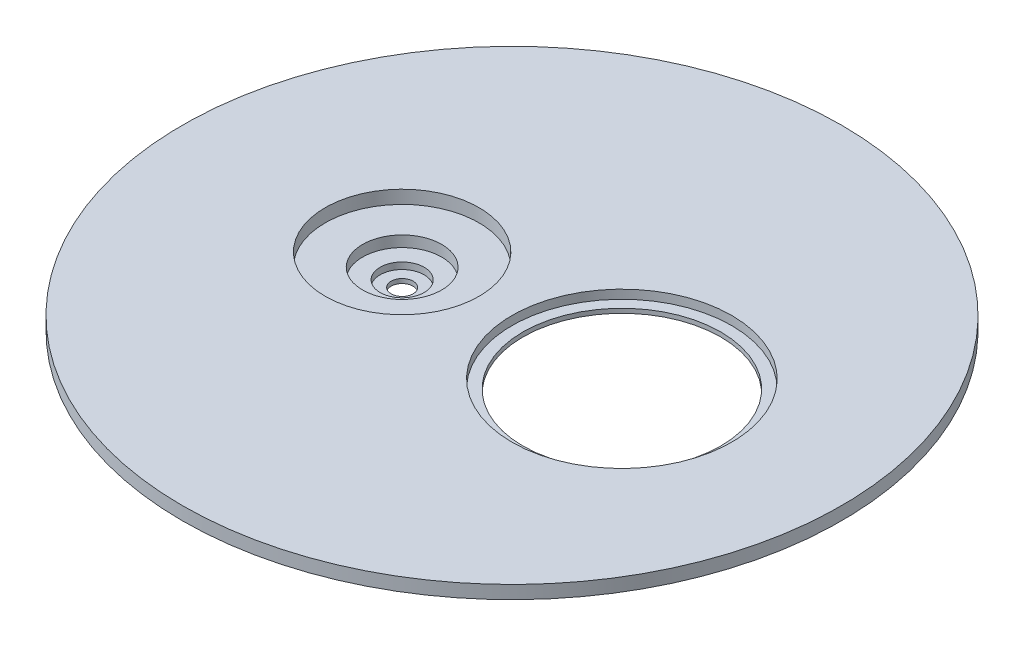
ISO-10303-21;
HEADER;
FILE_DESCRIPTION(('STEP AP214'),'2;1');
FILE_NAME('part.step','',(''),(''),'','','');
FILE_SCHEMA(('AUTOMOTIVE_DESIGN { 1 0 10303 214 1 1 1 1 }'));
ENDSEC;
DATA;
#1=APPLICATION_CONTEXT('core data for automotive mechanical design processes');
#2=APPLICATION_PROTOCOL_DEFINITION('international standard','automotive_design',2000,#1);
#3=PRODUCT_CONTEXT('',#1,'mechanical');
#4=PRODUCT('Part','Part','',(#3));
#5=PRODUCT_RELATED_PRODUCT_CATEGORY('part','',(#4));
#6=PRODUCT_DEFINITION_FORMATION('','',#4);
#7=PRODUCT_DEFINITION_CONTEXT('part definition',#1,'design');
#8=PRODUCT_DEFINITION('design','',#6,#7);
#9=PRODUCT_DEFINITION_SHAPE('','',#8);
#10=(LENGTH_UNIT() NAMED_UNIT(*) SI_UNIT(.MILLI.,.METRE.));
#11=(NAMED_UNIT(*) PLANE_ANGLE_UNIT() SI_UNIT($,.RADIAN.));
#12=(NAMED_UNIT(*) SI_UNIT($,.STERADIAN.) SOLID_ANGLE_UNIT());
#13=UNCERTAINTY_MEASURE_WITH_UNIT(LENGTH_MEASURE(1.E-05),#10,'distance_accuracy_value','');
#14=(GEOMETRIC_REPRESENTATION_CONTEXT(3) GLOBAL_UNCERTAINTY_ASSIGNED_CONTEXT((#13)) GLOBAL_UNIT_ASSIGNED_CONTEXT((#10,
#11,#12)) REPRESENTATION_CONTEXT('',''));
#15=CARTESIAN_POINT('',(0.,0.,0.));
#16=DIRECTION('',(0.,0.,1.));
#17=DIRECTION('',(1.,0.,0.));
#18=AXIS2_PLACEMENT_3D('',#15,#16,#17);
#19=CARTESIAN_POINT('',(-25.,-5.,0.));
#20=DIRECTION('',(0.,1.,0.));
#21=DIRECTION('',(0.,0.,1.));
#22=AXIS2_PLACEMENT_3D('',#19,#20,#21);
#23=CYLINDRICAL_SURFACE('',#22,2.5);
#24=CARTESIAN_POINT('',(-25.,-5.,0.));
#25=DIRECTION('',(0.,-1.,0.));
#26=DIRECTION('',(0.,0.,-1.));
#27=AXIS2_PLACEMENT_3D('',#24,#25,#26);
#28=CIRCLE('',#27,2.5);
#29=CARTESIAN_POINT('',(-25.,-5.,-2.5));
#30=VERTEX_POINT('',#29);
#31=EDGE_CURVE('E80',#30,#30,#28,.T.);
#32=ORIENTED_EDGE('',*,*,#31,.T.);
#33=EDGE_LOOP('',(#32));
#34=FACE_BOUND('',#33,.T.);
#35=CARTESIAN_POINT('',(-25.,-4.,0.));
#36=DIRECTION('',(0.,1.,0.));
#37=DIRECTION('',(0.,0.,1.));
#38=AXIS2_PLACEMENT_3D('',#35,#36,#37);
#39=CIRCLE('',#38,2.5);
#40=CARTESIAN_POINT('',(-25.,-4.,2.5));
#41=VERTEX_POINT('',#40);
#42=EDGE_CURVE('E36',#41,#41,#39,.T.);
#43=ORIENTED_EDGE('',*,*,#42,.T.);
#44=EDGE_LOOP('',(#43));
#45=FACE_BOUND('',#44,.T.);
#46=ADVANCED_FACE('F32',(#34,#45),#23,.F.);
#47=CARTESIAN_POINT('',(0.,3.,0.));
#48=DIRECTION('',(0.,-1.,0.));
#49=DIRECTION('',(0.,0.,-1.));
#50=AXIS2_PLACEMENT_3D('',#47,#48,#49);
#51=CYLINDRICAL_SURFACE('',#50,75.);
#52=CARTESIAN_POINT('',(0.,3.,0.));
#53=DIRECTION('',(0.,1.,0.));
#54=DIRECTION('',(0.,0.,1.));
#55=AXIS2_PLACEMENT_3D('',#52,#53,#54);
#56=CIRCLE('',#55,75.);
#57=CARTESIAN_POINT('',(0.,3.,75.));
#58=VERTEX_POINT('',#57);
#59=EDGE_CURVE('E40',#58,#58,#56,.T.);
#60=ORIENTED_EDGE('',*,*,#59,.F.);
#61=EDGE_LOOP('',(#60));
#62=FACE_BOUND('',#61,.T.);
#63=CARTESIAN_POINT('',(0.,0.,0.));
#64=DIRECTION('',(0.,1.,0.));
#65=DIRECTION('',(0.,0.,1.));
#66=AXIS2_PLACEMENT_3D('',#63,#64,#65);
#67=CIRCLE('',#66,75.);
#68=CARTESIAN_POINT('',(0.,0.,75.));
#69=VERTEX_POINT('',#68);
#70=EDGE_CURVE('E44',#69,#69,#67,.T.);
#71=ORIENTED_EDGE('',*,*,#70,.T.);
#72=EDGE_LOOP('',(#71));
#73=FACE_BOUND('',#72,.T.);
#74=ADVANCED_FACE('F34',(#62,#73),#51,.T.);
#75=CARTESIAN_POINT('',(0.,3.,0.));
#76=DIRECTION('',(0.,1.,0.));
#77=DIRECTION('',(0.,0.,1.));
#78=AXIS2_PLACEMENT_3D('',#75,#76,#77);
#79=PLANE('',#78);
#80=CARTESIAN_POINT('',(-25.,3.,0.));
#81=DIRECTION('',(0.,1.,0.));
#82=DIRECTION('',(0.,0.,1.));
#83=AXIS2_PLACEMENT_3D('',#80,#81,#82);
#84=CIRCLE('',#83,17.5);
#85=CARTESIAN_POINT('',(-25.,3.,17.5));
#86=VERTEX_POINT('',#85);
#87=EDGE_CURVE('E50',#86,#86,#84,.T.);
#88=ORIENTED_EDGE('',*,*,#87,.F.);
#89=EDGE_LOOP('',(#88));
#90=FACE_BOUND('',#89,.T.);
#91=CARTESIAN_POINT('',(25.,3.,0.));
#92=DIRECTION('',(0.,1.,0.));
#93=DIRECTION('',(0.,0.,1.));
#94=AXIS2_PLACEMENT_3D('',#91,#92,#93);
#95=CIRCLE('',#94,25.);
#96=CARTESIAN_POINT('',(25.,3.,25.));
#97=VERTEX_POINT('',#96);
#98=EDGE_CURVE('E55',#97,#97,#95,.T.);
#99=ORIENTED_EDGE('',*,*,#98,.F.);
#100=EDGE_LOOP('',(#99));
#101=FACE_BOUND('',#100,.T.);
#102=ORIENTED_EDGE('',*,*,#59,.T.);
#103=EDGE_LOOP('',(#102));
#104=FACE_BOUND('',#103,.T.);
#105=ADVANCED_FACE('F112',(#90,#101,#104),#79,.T.);
#106=CARTESIAN_POINT('',(0.,0.,0.));
#107=DIRECTION('',(0.,1.,0.));
#108=DIRECTION('',(0.,0.,1.));
#109=AXIS2_PLACEMENT_3D('',#106,#107,#108);
#110=PLANE('',#109);
#111=CARTESIAN_POINT('',(-25.,0.,0.));
#112=DIRECTION('',(0.,1.,0.));
#113=DIRECTION('',(0.,0.,1.));
#114=AXIS2_PLACEMENT_3D('',#111,#112,#113);
#115=CIRCLE('',#114,18.5);
#116=CARTESIAN_POINT('',(-25.,0.,18.5));
#117=VERTEX_POINT('',#116);
#118=EDGE_CURVE('E10',#117,#117,#115,.F.);
#119=ORIENTED_EDGE('',*,*,#118,.F.);
#120=EDGE_LOOP('',(#119));
#121=FACE_BOUND('',#120,.T.);
#122=CARTESIAN_POINT('',(25.,0.,0.));
#123=DIRECTION('',(0.,-1.,0.));
#124=DIRECTION('',(0.,0.,-1.));
#125=AXIS2_PLACEMENT_3D('',#122,#123,#124);
#126=CIRCLE('',#125,22.5);
#127=CARTESIAN_POINT('',(25.,0.,-22.5));
#128=VERTEX_POINT('',#127);
#129=EDGE_CURVE('E51',#128,#128,#126,.T.);
#130=ORIENTED_EDGE('',*,*,#129,.F.);
#131=EDGE_LOOP('',(#130));
#132=FACE_BOUND('',#131,.T.);
#133=ORIENTED_EDGE('',*,*,#70,.F.);
#134=EDGE_LOOP('',(#133));
#135=FACE_BOUND('',#134,.T.);
#136=ADVANCED_FACE('F157',(#121,#132,#135),#110,.F.);
#137=CARTESIAN_POINT('',(25.,1.,0.));
#138=DIRECTION('',(0.,1.,0.));
#139=DIRECTION('',(0.,0.,1.));
#140=AXIS2_PLACEMENT_3D('',#137,#138,#139);
#141=CYLINDRICAL_SURFACE('',#140,25.);
#142=CARTESIAN_POINT('',(25.,1.,0.));
#143=DIRECTION('',(0.,1.,0.));
#144=DIRECTION('',(0.,0.,1.));
#145=AXIS2_PLACEMENT_3D('',#142,#143,#144);
#146=CIRCLE('',#145,25.);
#147=CARTESIAN_POINT('',(25.,1.,25.));
#148=VERTEX_POINT('',#147);
#149=EDGE_CURVE('E53',#148,#148,#146,.T.);
#150=ORIENTED_EDGE('',*,*,#149,.F.);
#151=EDGE_LOOP('',(#150));
#152=FACE_BOUND('',#151,.T.);
#153=ORIENTED_EDGE('',*,*,#98,.T.);
#154=EDGE_LOOP('',(#153));
#155=FACE_BOUND('',#154,.T.);
#156=ADVANCED_FACE('F153',(#152,#155),#141,.F.);
#157=CARTESIAN_POINT('',(25.,1.,0.));
#158=DIRECTION('',(0.,1.,0.));
#159=DIRECTION('',(0.,0.,1.));
#160=AXIS2_PLACEMENT_3D('',#157,#158,#159);
#161=PLANE('',#160);
#162=CARTESIAN_POINT('',(25.,1.,0.));
#163=DIRECTION('',(0.,1.,0.));
#164=DIRECTION('',(0.,0.,1.));
#165=AXIS2_PLACEMENT_3D('',#162,#163,#164);
#166=CIRCLE('',#165,22.5);
#167=CARTESIAN_POINT('',(25.,1.,22.5));
#168=VERTEX_POINT('',#167);
#169=EDGE_CURVE('E47',#168,#168,#166,.T.);
#170=ORIENTED_EDGE('',*,*,#169,.F.);
#171=EDGE_LOOP('',(#170));
#172=FACE_BOUND('',#171,.T.);
#173=ORIENTED_EDGE('',*,*,#149,.T.);
#174=EDGE_LOOP('',(#173));
#175=FACE_BOUND('',#174,.T.);
#176=ADVANCED_FACE('F149',(#172,#175),#161,.T.);
#177=CARTESIAN_POINT('',(-25.,1.,0.));
#178=DIRECTION('',(0.,1.,0.));
#179=DIRECTION('',(0.,0.,1.));
#180=AXIS2_PLACEMENT_3D('',#177,#178,#179);
#181=CYLINDRICAL_SURFACE('',#180,17.5);
#182=ORIENTED_EDGE('',*,*,#87,.T.);
#183=EDGE_LOOP('',(#182));
#184=FACE_BOUND('',#183,.T.);
#185=CARTESIAN_POINT('',(-25.,0.,0.));
#186=DIRECTION('',(0.,1.,0.));
#187=DIRECTION('',(0.,0.,1.));
#188=AXIS2_PLACEMENT_3D('',#185,#186,#187);
#189=CIRCLE('',#188,17.5);
#190=CARTESIAN_POINT('',(-25.,0.,17.5));
#191=VERTEX_POINT('',#190);
#192=EDGE_CURVE('E64',#191,#191,#189,.T.);
#193=ORIENTED_EDGE('',*,*,#192,.F.);
#194=EDGE_LOOP('',(#193));
#195=FACE_BOUND('',#194,.T.);
#196=ADVANCED_FACE('F145',(#184,#195),#181,.F.);
#197=CARTESIAN_POINT('',(25.,2.,0.));
#198=DIRECTION('',(0.,-1.,0.));
#199=DIRECTION('',(0.,0.,-1.));
#200=AXIS2_PLACEMENT_3D('',#197,#198,#199);
#201=CYLINDRICAL_SURFACE('',#200,22.5);
#202=ORIENTED_EDGE('',*,*,#169,.T.);
#203=EDGE_LOOP('',(#202));
#204=FACE_BOUND('',#203,.T.);
#205=ORIENTED_EDGE('',*,*,#129,.T.);
#206=EDGE_LOOP('',(#205));
#207=FACE_BOUND('',#206,.T.);
#208=ADVANCED_FACE('F138',(#204,#207),#201,.F.);
#209=CARTESIAN_POINT('',(-25.,0.,0.));
#210=DIRECTION('',(0.,-1.,0.));
#211=DIRECTION('',(0.,0.,-1.));
#212=AXIS2_PLACEMENT_3D('',#209,#210,#211);
#213=PLANE('',#212);
#214=CARTESIAN_POINT('',(-25.,0.,0.));
#215=DIRECTION('',(0.,-1.,0.));
#216=DIRECTION('',(0.,0.,-1.));
#217=AXIS2_PLACEMENT_3D('',#214,#215,#216);
#218=CIRCLE('',#217,9.);
#219=CARTESIAN_POINT('',(-25.,0.,-9.));
#220=VERTEX_POINT('',#219);
#221=EDGE_CURVE('E70',#220,#220,#218,.T.);
#222=ORIENTED_EDGE('',*,*,#221,.T.);
#223=EDGE_LOOP('',(#222));
#224=FACE_BOUND('',#223,.T.);
#225=ORIENTED_EDGE('',*,*,#192,.T.);
#226=EDGE_LOOP('',(#225));
#227=FACE_BOUND('',#226,.T.);
#228=ADVANCED_FACE('F134',(#224,#227),#213,.F.);
#229=CARTESIAN_POINT('',(-25.,-2.5,0.));
#230=DIRECTION('',(0.,-1.,0.));
#231=DIRECTION('',(0.,0.,-1.));
#232=AXIS2_PLACEMENT_3D('',#229,#230,#231);
#233=PLANE('',#232);
#234=CARTESIAN_POINT('',(-25.,-2.5,0.));
#235=DIRECTION('',(0.,-1.,0.));
#236=DIRECTION('',(0.,0.,-1.));
#237=AXIS2_PLACEMENT_3D('',#234,#235,#236);
#238=CIRCLE('',#237,10.);
#239=CARTESIAN_POINT('',(-25.,-2.5,-9.99999999999999));
#240=VERTEX_POINT('',#239);
#241=EDGE_CURVE('E77',#240,#240,#238,.T.);
#242=ORIENTED_EDGE('',*,*,#241,.F.);
#243=EDGE_LOOP('',(#242));
#244=FACE_BOUND('',#243,.T.);
#245=CARTESIAN_POINT('',(-25.,-2.5,0.));
#246=DIRECTION('',(0.,-1.,0.));
#247=DIRECTION('',(0.,0.,-1.));
#248=AXIS2_PLACEMENT_3D('',#245,#246,#247);
#249=CIRCLE('',#248,18.5);
#250=CARTESIAN_POINT('',(-25.,-2.5,-18.5));
#251=VERTEX_POINT('',#250);
#252=EDGE_CURVE('E67',#251,#251,#249,.T.);
#253=ORIENTED_EDGE('',*,*,#252,.T.);
#254=EDGE_LOOP('',(#253));
#255=FACE_BOUND('',#254,.T.);
#256=ADVANCED_FACE('F131',(#244,#255),#233,.T.);
#257=CARTESIAN_POINT('',(-25.,-2.5,0.));
#258=DIRECTION('',(0.,1.,0.));
#259=DIRECTION('',(0.,0.,1.));
#260=AXIS2_PLACEMENT_3D('',#257,#258,#259);
#261=CYLINDRICAL_SURFACE('',#260,18.5);
#262=ORIENTED_EDGE('',*,*,#252,.F.);
#263=EDGE_LOOP('',(#262));
#264=FACE_BOUND('',#263,.T.);
#265=ORIENTED_EDGE('',*,*,#118,.T.);
#266=EDGE_LOOP('',(#265));
#267=FACE_BOUND('',#266,.T.);
#268=ADVANCED_FACE('F129',(#264,#267),#261,.T.);
#269=CARTESIAN_POINT('',(-25.,-2.5,0.));
#270=DIRECTION('',(0.,1.,0.));
#271=DIRECTION('',(0.,0.,1.));
#272=AXIS2_PLACEMENT_3D('',#269,#270,#271);
#273=CYLINDRICAL_SURFACE('',#272,9.);
#274=CARTESIAN_POINT('',(-25.,-2.5,0.));
#275=DIRECTION('',(0.,-1.,0.));
#276=DIRECTION('',(0.,0.,-1.));
#277=AXIS2_PLACEMENT_3D('',#274,#275,#276);
#278=CIRCLE('',#277,9.);
#279=CARTESIAN_POINT('',(-25.,-2.5,-9.));
#280=VERTEX_POINT('',#279);
#281=EDGE_CURVE('E73',#280,#280,#278,.T.);
#282=ORIENTED_EDGE('',*,*,#281,.T.);
#283=EDGE_LOOP('',(#282));
#284=FACE_BOUND('',#283,.T.);
#285=ORIENTED_EDGE('',*,*,#221,.F.);
#286=EDGE_LOOP('',(#285));
#287=FACE_BOUND('',#286,.T.);
#288=ADVANCED_FACE('F122',(#284,#287),#273,.F.);
#289=CARTESIAN_POINT('',(-25.,-2.5,0.));
#290=DIRECTION('',(0.,-1.,0.));
#291=DIRECTION('',(0.,0.,-1.));
#292=AXIS2_PLACEMENT_3D('',#289,#290,#291);
#293=PLANE('',#292);
#294=CARTESIAN_POINT('',(-25.,-2.5,0.));
#295=DIRECTION('',(0.,1.,0.));
#296=DIRECTION('',(0.,0.,1.));
#297=AXIS2_PLACEMENT_3D('',#294,#295,#296);
#298=CIRCLE('',#297,5.);
#299=CARTESIAN_POINT('',(-25.,-2.5,5.));
#300=VERTEX_POINT('',#299);
#301=EDGE_CURVE('E85',#300,#300,#298,.T.);
#302=ORIENTED_EDGE('',*,*,#301,.F.);
#303=EDGE_LOOP('',(#302));
#304=FACE_BOUND('',#303,.T.);
#305=ORIENTED_EDGE('',*,*,#281,.F.);
#306=EDGE_LOOP('',(#305));
#307=FACE_BOUND('',#306,.T.);
#308=ADVANCED_FACE('F118',(#304,#307),#293,.F.);
#309=CARTESIAN_POINT('',(-25.,-5.,0.));
#310=DIRECTION('',(0.,-1.,0.));
#311=DIRECTION('',(0.,0.,-1.));
#312=AXIS2_PLACEMENT_3D('',#309,#310,#311);
#313=PLANE('',#312);
#314=CARTESIAN_POINT('',(-25.,-5.,0.));
#315=DIRECTION('',(0.,-1.,0.));
#316=DIRECTION('',(0.,0.,-1.));
#317=AXIS2_PLACEMENT_3D('',#314,#315,#316);
#318=CIRCLE('',#317,10.);
#319=CARTESIAN_POINT('',(-25.,-5.,-9.99999999999999));
#320=VERTEX_POINT('',#319);
#321=EDGE_CURVE('E76',#320,#320,#318,.T.);
#322=ORIENTED_EDGE('',*,*,#321,.T.);
#323=EDGE_LOOP('',(#322));
#324=FACE_BOUND('',#323,.T.);
#325=ORIENTED_EDGE('',*,*,#31,.F.);
#326=EDGE_LOOP('',(#325));
#327=FACE_BOUND('',#326,.T.);
#328=ADVANCED_FACE('F115',(#324,#327),#313,.T.);
#329=CARTESIAN_POINT('',(-25.,-5.,0.));
#330=DIRECTION('',(0.,1.,0.));
#331=DIRECTION('',(0.,0.,1.));
#332=AXIS2_PLACEMENT_3D('',#329,#330,#331);
#333=CYLINDRICAL_SURFACE('',#332,10.);
#334=ORIENTED_EDGE('',*,*,#321,.F.);
#335=EDGE_LOOP('',(#334));
#336=FACE_BOUND('',#335,.T.);
#337=ORIENTED_EDGE('',*,*,#241,.T.);
#338=EDGE_LOOP('',(#337));
#339=FACE_BOUND('',#338,.T.);
#340=ADVANCED_FACE('F103',(#336,#339),#333,.T.);
#341=CARTESIAN_POINT('',(-25.,-4.,0.));
#342=DIRECTION('',(0.,1.,0.));
#343=DIRECTION('',(0.,0.,1.));
#344=AXIS2_PLACEMENT_3D('',#341,#342,#343);
#345=CYLINDRICAL_SURFACE('',#344,5.);
#346=CARTESIAN_POINT('',(-25.,-4.,0.));
#347=DIRECTION('',(0.,1.,0.));
#348=DIRECTION('',(0.,0.,1.));
#349=AXIS2_PLACEMENT_3D('',#346,#347,#348);
#350=CIRCLE('',#349,5.);
#351=CARTESIAN_POINT('',(-25.,-4.,5.));
#352=VERTEX_POINT('',#351);
#353=EDGE_CURVE('E88',#352,#352,#350,.T.);
#354=ORIENTED_EDGE('',*,*,#353,.F.);
#355=EDGE_LOOP('',(#354));
#356=FACE_BOUND('',#355,.T.);
#357=ORIENTED_EDGE('',*,*,#301,.T.);
#358=EDGE_LOOP('',(#357));
#359=FACE_BOUND('',#358,.T.);
#360=ADVANCED_FACE('F98',(#356,#359),#345,.F.);
#361=CARTESIAN_POINT('',(-25.,-4.,0.));
#362=DIRECTION('',(0.,1.,0.));
#363=DIRECTION('',(0.,0.,1.));
#364=AXIS2_PLACEMENT_3D('',#361,#362,#363);
#365=PLANE('',#364);
#366=ORIENTED_EDGE('',*,*,#42,.F.);
#367=EDGE_LOOP('',(#366));
#368=FACE_BOUND('',#367,.T.);
#369=ORIENTED_EDGE('',*,*,#353,.T.);
#370=EDGE_LOOP('',(#369));
#371=FACE_BOUND('',#370,.T.);
#372=ADVANCED_FACE('F96',(#368,#371),#365,.T.);
#373=CLOSED_SHELL('',(#46,#74,#105,#136,#156,#176,#196,#208,#228,#256,#268,#288,#308,#328,#340,
#360,#372));
#374=MANIFOLD_SOLID_BREP('B2',#373);
#375=ADVANCED_BREP_SHAPE_REPRESENTATION('',(#18,#374),#14);
#376=SHAPE_DEFINITION_REPRESENTATION(#9,#375);
ENDSEC;
END-ISO-10303-21;
